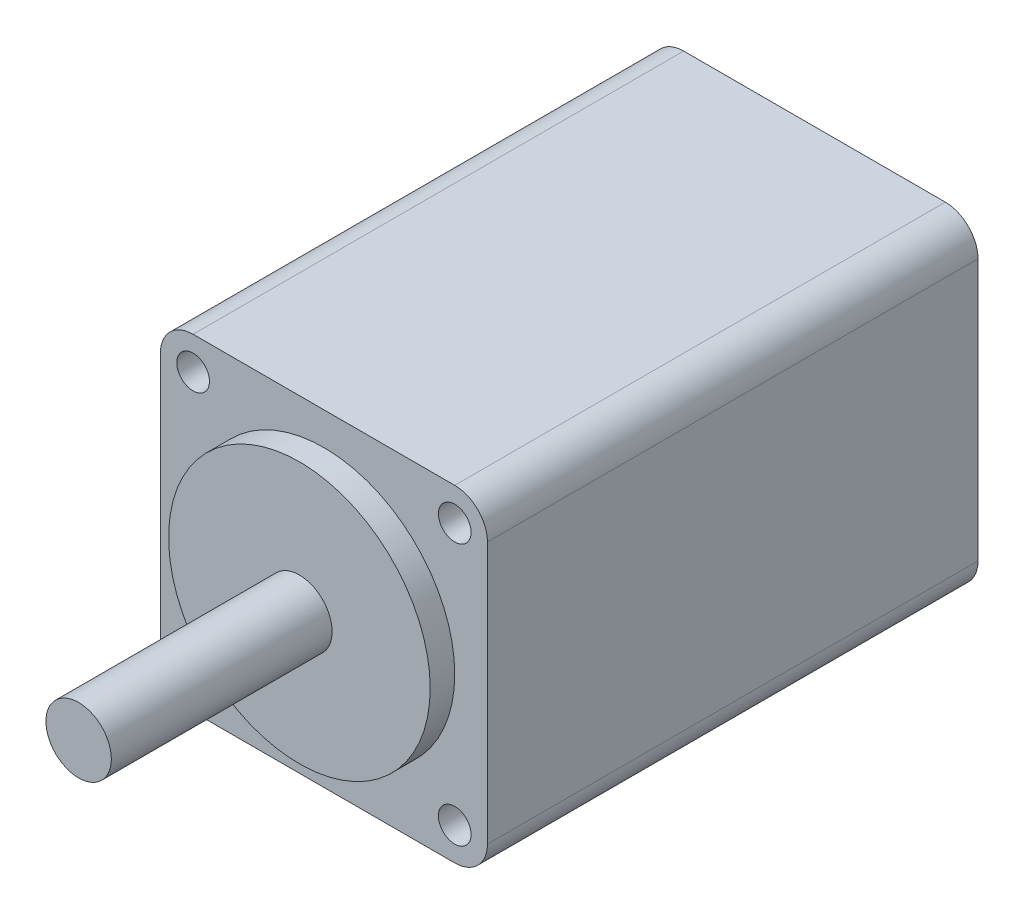
ISO-10303-21;
HEADER;
FILE_DESCRIPTION(('STEP AP214'),'2;1');
FILE_NAME('part.step','',(''),(''),'','','');
FILE_SCHEMA(('AUTOMOTIVE_DESIGN { 1 0 10303 214 1 1 1 1 }'));
ENDSEC;
DATA;
#1=APPLICATION_CONTEXT('core data for automotive mechanical design processes');
#2=APPLICATION_PROTOCOL_DEFINITION('international standard','automotive_design',2000,#1);
#3=PRODUCT_CONTEXT('',#1,'mechanical');
#4=PRODUCT('Part','Part','',(#3));
#5=PRODUCT_RELATED_PRODUCT_CATEGORY('part','',(#4));
#6=PRODUCT_DEFINITION_FORMATION('','',#4);
#7=PRODUCT_DEFINITION_CONTEXT('part definition',#1,'design');
#8=PRODUCT_DEFINITION('design','',#6,#7);
#9=PRODUCT_DEFINITION_SHAPE('','',#8);
#10=(LENGTH_UNIT() NAMED_UNIT(*) SI_UNIT(.MILLI.,.METRE.));
#11=(NAMED_UNIT(*) PLANE_ANGLE_UNIT() SI_UNIT($,.RADIAN.));
#12=(NAMED_UNIT(*) SI_UNIT($,.STERADIAN.) SOLID_ANGLE_UNIT());
#13=UNCERTAINTY_MEASURE_WITH_UNIT(LENGTH_MEASURE(1.E-05),#10,'distance_accuracy_value','');
#14=(GEOMETRIC_REPRESENTATION_CONTEXT(3) GLOBAL_UNCERTAINTY_ASSIGNED_CONTEXT((#13)) GLOBAL_UNIT_ASSIGNED_CONTEXT((#10,
#11,#12)) REPRESENTATION_CONTEXT('',''));
#15=CARTESIAN_POINT('',(0.,0.,0.));
#16=DIRECTION('',(0.,0.,1.));
#17=DIRECTION('',(1.,0.,0.));
#18=AXIS2_PLACEMENT_3D('',#15,#16,#17);
#19=CARTESIAN_POINT('',(10.,10.,-30.));
#20=DIRECTION('',(1.,0.,0.));
#21=DIRECTION('',(0.,1.,0.));
#22=AXIS2_PLACEMENT_3D('',#19,#20,#21);
#23=PLANE('',#22);
#24=DIRECTION('',(0.,1.,0.));
#25=VECTOR('',#24,1.);
#26=CARTESIAN_POINT('',(10.,10.,0.));
#27=LINE('',#26,#25);
#28=CARTESIAN_POINT('',(10.,-8.,0.));
#29=VERTEX_POINT('',#28);
#30=CARTESIAN_POINT('',(10.,8.,0.));
#31=VERTEX_POINT('',#30);
#32=EDGE_CURVE('E154',#29,#31,#27,.T.);
#33=ORIENTED_EDGE('',*,*,#32,.F.);
#34=DIRECTION('',(0.,0.,1.));
#35=VECTOR('',#34,1.);
#36=CARTESIAN_POINT('',(10.,-8.,-30.));
#37=LINE('',#36,#35);
#38=CARTESIAN_POINT('',(10.,-8.,-30.));
#39=VERTEX_POINT('',#38);
#40=EDGE_CURVE('E12',#29,#39,#37,.F.);
#41=ORIENTED_EDGE('',*,*,#40,.T.);
#42=DIRECTION('',(0.,1.,0.));
#43=VECTOR('',#42,1.);
#44=CARTESIAN_POINT('',(10.,10.,-30.));
#45=LINE('',#44,#43);
#46=CARTESIAN_POINT('',(10.,8.,-30.));
#47=VERTEX_POINT('',#46);
#48=EDGE_CURVE('E157',#39,#47,#45,.T.);
#49=ORIENTED_EDGE('',*,*,#48,.T.);
#50=DIRECTION('',(0.,0.,1.));
#51=VECTOR('',#50,1.);
#52=CARTESIAN_POINT('',(10.,8.,-30.));
#53=LINE('',#52,#51);
#54=EDGE_CURVE('E42',#47,#31,#53,.T.);
#55=ORIENTED_EDGE('',*,*,#54,.T.);
#56=EDGE_LOOP('',(#33,#41,#49,#55));
#57=FACE_BOUND('',#56,.T.);
#58=ADVANCED_FACE('F34',(#57),#23,.T.);
#59=CARTESIAN_POINT('',(-10.,-10.,-30.));
#60=DIRECTION('',(0.,-1.,0.));
#61=DIRECTION('',(0.,0.,-1.));
#62=AXIS2_PLACEMENT_3D('',#59,#60,#61);
#63=PLANE('',#62);
#64=DIRECTION('',(1.,0.,0.));
#65=VECTOR('',#64,1.);
#66=CARTESIAN_POINT('',(-10.,-10.,0.));
#67=LINE('',#66,#65);
#68=CARTESIAN_POINT('',(-8.,-10.,0.));
#69=VERTEX_POINT('',#68);
#70=CARTESIAN_POINT('',(8.,-10.,0.));
#71=VERTEX_POINT('',#70);
#72=EDGE_CURVE('E119',#69,#71,#67,.T.);
#73=ORIENTED_EDGE('',*,*,#72,.F.);
#74=DIRECTION('',(0.,0.,1.));
#75=VECTOR('',#74,1.);
#76=CARTESIAN_POINT('',(-8.,-10.,-30.));
#77=LINE('',#76,#75);
#78=CARTESIAN_POINT('',(-8.,-10.,-30.));
#79=VERTEX_POINT('',#78);
#80=EDGE_CURVE('E137',#69,#79,#77,.F.);
#81=ORIENTED_EDGE('',*,*,#80,.T.);
#82=DIRECTION('',(1.,0.,0.));
#83=VECTOR('',#82,1.);
#84=CARTESIAN_POINT('',(-10.,-10.,-30.));
#85=LINE('',#84,#83);
#86=CARTESIAN_POINT('',(8.,-10.,-30.));
#87=VERTEX_POINT('',#86);
#88=EDGE_CURVE('E122',#79,#87,#85,.T.);
#89=ORIENTED_EDGE('',*,*,#88,.T.);
#90=DIRECTION('',(0.,0.,1.));
#91=VECTOR('',#90,1.);
#92=CARTESIAN_POINT('',(8.,-10.,-30.));
#93=LINE('',#92,#91);
#94=EDGE_CURVE('E134',#87,#71,#93,.T.);
#95=ORIENTED_EDGE('',*,*,#94,.T.);
#96=EDGE_LOOP('',(#73,#81,#89,#95));
#97=FACE_BOUND('',#96,.T.);
#98=ADVANCED_FACE('F246',(#97),#63,.T.);
#99=CARTESIAN_POINT('',(-10.,10.,-30.));
#100=DIRECTION('',(-1.,0.,0.));
#101=DIRECTION('',(0.,-1.,0.));
#102=AXIS2_PLACEMENT_3D('',#99,#100,#101);
#103=PLANE('',#102);
#104=DIRECTION('',(0.,-1.,0.));
#105=VECTOR('',#104,1.);
#106=CARTESIAN_POINT('',(-10.,10.,-30.));
#107=LINE('',#106,#105);
#108=CARTESIAN_POINT('',(-10.,8.,-30.));
#109=VERTEX_POINT('',#108);
#110=CARTESIAN_POINT('',(-10.,-8.,-30.));
#111=VERTEX_POINT('',#110);
#112=EDGE_CURVE('E127',#109,#111,#107,.T.);
#113=ORIENTED_EDGE('',*,*,#112,.T.);
#114=DIRECTION('',(0.,0.,1.));
#115=VECTOR('',#114,1.);
#116=CARTESIAN_POINT('',(-10.,-8.,-30.));
#117=LINE('',#116,#115);
#118=CARTESIAN_POINT('',(-10.,-8.,0.));
#119=VERTEX_POINT('',#118);
#120=EDGE_CURVE('E118',#111,#119,#117,.T.);
#121=ORIENTED_EDGE('',*,*,#120,.T.);
#122=DIRECTION('',(0.,-1.,0.));
#123=VECTOR('',#122,1.);
#124=CARTESIAN_POINT('',(-10.,10.,0.));
#125=LINE('',#124,#123);
#126=CARTESIAN_POINT('',(-10.,8.,0.));
#127=VERTEX_POINT('',#126);
#128=EDGE_CURVE('E103',#127,#119,#125,.T.);
#129=ORIENTED_EDGE('',*,*,#128,.F.);
#130=DIRECTION('',(0.,0.,1.));
#131=VECTOR('',#130,1.);
#132=CARTESIAN_POINT('',(-10.,8.,-30.));
#133=LINE('',#132,#131);
#134=EDGE_CURVE('E116',#127,#109,#133,.F.);
#135=ORIENTED_EDGE('',*,*,#134,.T.);
#136=EDGE_LOOP('',(#113,#121,#129,#135));
#137=FACE_BOUND('',#136,.T.);
#138=ADVANCED_FACE('F115',(#137),#103,.T.);
#139=CARTESIAN_POINT('',(-10.,10.,-30.));
#140=DIRECTION('',(0.,1.,0.));
#141=DIRECTION('',(0.,0.,1.));
#142=AXIS2_PLACEMENT_3D('',#139,#140,#141);
#143=PLANE('',#142);
#144=DIRECTION('',(-1.,0.,0.));
#145=VECTOR('',#144,1.);
#146=CARTESIAN_POINT('',(-10.,10.,-30.));
#147=LINE('',#146,#145);
#148=CARTESIAN_POINT('',(8.,10.,-30.));
#149=VERTEX_POINT('',#148);
#150=CARTESIAN_POINT('',(-8.,10.,-30.));
#151=VERTEX_POINT('',#150);
#152=EDGE_CURVE('E169',#149,#151,#147,.T.);
#153=ORIENTED_EDGE('',*,*,#152,.T.);
#154=DIRECTION('',(0.,0.,1.));
#155=VECTOR('',#154,1.);
#156=CARTESIAN_POINT('',(-8.,10.,-30.));
#157=LINE('',#156,#155);
#158=CARTESIAN_POINT('',(-8.,10.,0.));
#159=VERTEX_POINT('',#158);
#160=EDGE_CURVE('E147',#151,#159,#157,.T.);
#161=ORIENTED_EDGE('',*,*,#160,.T.);
#162=DIRECTION('',(-1.,0.,0.));
#163=VECTOR('',#162,1.);
#164=CARTESIAN_POINT('',(-10.,10.,0.));
#165=LINE('',#164,#163);
#166=CARTESIAN_POINT('',(8.,10.,0.));
#167=VERTEX_POINT('',#166);
#168=EDGE_CURVE('E104',#167,#159,#165,.T.);
#169=ORIENTED_EDGE('',*,*,#168,.F.);
#170=DIRECTION('',(0.,0.,1.));
#171=VECTOR('',#170,1.);
#172=CARTESIAN_POINT('',(8.,10.,-30.));
#173=LINE('',#172,#171);
#174=EDGE_CURVE('E56',#167,#149,#173,.F.);
#175=ORIENTED_EDGE('',*,*,#174,.T.);
#176=EDGE_LOOP('',(#153,#161,#169,#175));
#177=FACE_BOUND('',#176,.T.);
#178=ADVANCED_FACE('F255',(#177),#143,.T.);
#179=CARTESIAN_POINT('',(0.,0.,-30.));
#180=DIRECTION('',(0.,0.,1.));
#181=DIRECTION('',(1.,0.,0.));
#182=AXIS2_PLACEMENT_3D('',#179,#180,#181);
#183=PLANE('',#182);
#184=ORIENTED_EDGE('',*,*,#88,.F.);
#185=CARTESIAN_POINT('',(-8.,-8.,-30.));
#186=DIRECTION('',(0.,0.,1.));
#187=DIRECTION('',(1.,0.,0.));
#188=AXIS2_PLACEMENT_3D('',#185,#186,#187);
#189=CIRCLE('',#188,2.);
#190=EDGE_CURVE('E144',#79,#111,#189,.F.);
#191=ORIENTED_EDGE('',*,*,#190,.T.);
#192=ORIENTED_EDGE('',*,*,#112,.F.);
#193=CARTESIAN_POINT('',(-8.,8.,-30.));
#194=DIRECTION('',(0.,0.,1.));
#195=DIRECTION('',(1.,0.,0.));
#196=AXIS2_PLACEMENT_3D('',#193,#194,#195);
#197=CIRCLE('',#196,2.);
#198=EDGE_CURVE('E49',#109,#151,#197,.F.);
#199=ORIENTED_EDGE('',*,*,#198,.T.);
#200=ORIENTED_EDGE('',*,*,#152,.F.);
#201=CARTESIAN_POINT('',(8.,8.,-30.));
#202=DIRECTION('',(0.,0.,1.));
#203=DIRECTION('',(1.,0.,0.));
#204=AXIS2_PLACEMENT_3D('',#201,#202,#203);
#205=CIRCLE('',#204,2.);
#206=EDGE_CURVE('E139',#149,#47,#205,.F.);
#207=ORIENTED_EDGE('',*,*,#206,.T.);
#208=ORIENTED_EDGE('',*,*,#48,.F.);
#209=CARTESIAN_POINT('',(8.,-8.,-30.));
#210=DIRECTION('',(0.,0.,1.));
#211=DIRECTION('',(1.,0.,0.));
#212=AXIS2_PLACEMENT_3D('',#209,#210,#211);
#213=CIRCLE('',#212,2.);
#214=EDGE_CURVE('E141',#39,#87,#213,.F.);
#215=ORIENTED_EDGE('',*,*,#214,.T.);
#216=EDGE_LOOP('',(#184,#191,#192,#199,#200,#207,#208,#215));
#217=FACE_BOUND('',#216,.T.);
#218=ADVANCED_FACE('F223',(#217),#183,.F.);
#219=CARTESIAN_POINT('',(0.,0.,0.));
#220=DIRECTION('',(0.,0.,1.));
#221=DIRECTION('',(1.,0.,0.));
#222=AXIS2_PLACEMENT_3D('',#219,#220,#221);
#223=PLANE('',#222);
#224=CARTESIAN_POINT('',(0.,0.,0.));
#225=DIRECTION('',(0.,0.,1.));
#226=DIRECTION('',(1.,0.,0.));
#227=AXIS2_PLACEMENT_3D('',#224,#225,#226);
#228=CIRCLE('',#227,8.);
#229=CARTESIAN_POINT('',(8.,0.,0.));
#230=VERTEX_POINT('',#229);
#231=EDGE_CURVE('E193',#230,#230,#228,.T.);
#232=ORIENTED_EDGE('',*,*,#231,.F.);
#233=EDGE_LOOP('',(#232));
#234=FACE_BOUND('',#233,.T.);
#235=CARTESIAN_POINT('',(8.,8.,0.));
#236=DIRECTION('',(0.,0.,1.));
#237=DIRECTION('',(1.,0.,0.));
#238=AXIS2_PLACEMENT_3D('',#235,#236,#237);
#239=CIRCLE('',#238,0.999999999999999);
#240=CARTESIAN_POINT('',(9.,8.,0.));
#241=VERTEX_POINT('',#240);
#242=EDGE_CURVE('E188',#241,#241,#239,.T.);
#243=ORIENTED_EDGE('',*,*,#242,.F.);
#244=EDGE_LOOP('',(#243));
#245=FACE_BOUND('',#244,.T.);
#246=CARTESIAN_POINT('',(8.,-8.,0.));
#247=DIRECTION('',(0.,0.,1.));
#248=DIRECTION('',(1.,0.,0.));
#249=AXIS2_PLACEMENT_3D('',#246,#247,#248);
#250=CIRCLE('',#249,1.);
#251=CARTESIAN_POINT('',(9.,-8.,0.));
#252=VERTEX_POINT('',#251);
#253=EDGE_CURVE('E182',#252,#252,#250,.T.);
#254=ORIENTED_EDGE('',*,*,#253,.F.);
#255=EDGE_LOOP('',(#254));
#256=FACE_BOUND('',#255,.T.);
#257=CARTESIAN_POINT('',(-8.,-8.,0.));
#258=DIRECTION('',(0.,0.,1.));
#259=DIRECTION('',(1.,0.,0.));
#260=AXIS2_PLACEMENT_3D('',#257,#258,#259);
#261=CIRCLE('',#260,1.);
#262=CARTESIAN_POINT('',(-7.,-8.,0.));
#263=VERTEX_POINT('',#262);
#264=EDGE_CURVE('E175',#263,#263,#261,.T.);
#265=ORIENTED_EDGE('',*,*,#264,.F.);
#266=EDGE_LOOP('',(#265));
#267=FACE_BOUND('',#266,.T.);
#268=CARTESIAN_POINT('',(-8.,8.,0.));
#269=DIRECTION('',(0.,0.,1.));
#270=DIRECTION('',(1.,0.,0.));
#271=AXIS2_PLACEMENT_3D('',#268,#269,#270);
#272=CIRCLE('',#271,1.);
#273=CARTESIAN_POINT('',(-7.,8.,0.));
#274=VERTEX_POINT('',#273);
#275=EDGE_CURVE('E165',#274,#274,#272,.T.);
#276=ORIENTED_EDGE('',*,*,#275,.F.);
#277=EDGE_LOOP('',(#276));
#278=FACE_BOUND('',#277,.T.);
#279=ORIENTED_EDGE('',*,*,#128,.T.);
#280=CARTESIAN_POINT('',(-8.,-8.,0.));
#281=DIRECTION('',(0.,0.,1.));
#282=DIRECTION('',(1.,0.,0.));
#283=AXIS2_PLACEMENT_3D('',#280,#281,#282);
#284=CIRCLE('',#283,2.);
#285=EDGE_CURVE('E109',#119,#69,#284,.T.);
#286=ORIENTED_EDGE('',*,*,#285,.T.);
#287=ORIENTED_EDGE('',*,*,#72,.T.);
#288=CARTESIAN_POINT('',(8.,-8.,0.));
#289=DIRECTION('',(0.,0.,1.));
#290=DIRECTION('',(1.,0.,0.));
#291=AXIS2_PLACEMENT_3D('',#288,#289,#290);
#292=CIRCLE('',#291,2.);
#293=EDGE_CURVE('E110',#71,#29,#292,.T.);
#294=ORIENTED_EDGE('',*,*,#293,.T.);
#295=ORIENTED_EDGE('',*,*,#32,.T.);
#296=CARTESIAN_POINT('',(8.,8.,0.));
#297=DIRECTION('',(0.,0.,1.));
#298=DIRECTION('',(1.,0.,0.));
#299=AXIS2_PLACEMENT_3D('',#296,#297,#298);
#300=CIRCLE('',#299,2.);
#301=EDGE_CURVE('E124',#31,#167,#300,.T.);
#302=ORIENTED_EDGE('',*,*,#301,.T.);
#303=ORIENTED_EDGE('',*,*,#168,.T.);
#304=CARTESIAN_POINT('',(-8.,8.,0.));
#305=DIRECTION('',(0.,0.,1.));
#306=DIRECTION('',(1.,0.,0.));
#307=AXIS2_PLACEMENT_3D('',#304,#305,#306);
#308=CIRCLE('',#307,2.);
#309=EDGE_CURVE('E100',#159,#127,#308,.T.);
#310=ORIENTED_EDGE('',*,*,#309,.T.);
#311=EDGE_LOOP('',(#279,#286,#287,#294,#295,#302,#303,#310));
#312=FACE_BOUND('',#311,.T.);
#313=ADVANCED_FACE('F102',(#234,#245,#256,#267,#278,#312),#223,.T.);
#314=CARTESIAN_POINT('',(-8.,8.,-6.));
#315=DIRECTION('',(0.,0.,1.));
#316=DIRECTION('',(1.,0.,0.));
#317=AXIS2_PLACEMENT_3D('',#314,#315,#316);
#318=CYLINDRICAL_SURFACE('',#317,1.);
#319=CARTESIAN_POINT('',(-8.,8.,-6.));
#320=DIRECTION('',(0.,0.,1.));
#321=DIRECTION('',(1.,0.,0.));
#322=AXIS2_PLACEMENT_3D('',#319,#320,#321);
#323=CIRCLE('',#322,1.);
#324=CARTESIAN_POINT('',(-7.,8.,-6.));
#325=VERTEX_POINT('',#324);
#326=EDGE_CURVE('E161',#325,#325,#323,.T.);
#327=ORIENTED_EDGE('',*,*,#326,.F.);
#328=EDGE_LOOP('',(#327));
#329=FACE_BOUND('',#328,.T.);
#330=ORIENTED_EDGE('',*,*,#275,.T.);
#331=EDGE_LOOP('',(#330));
#332=FACE_BOUND('',#331,.T.);
#333=ADVANCED_FACE('F222',(#329,#332),#318,.F.);
#334=CARTESIAN_POINT('',(-8.,8.,-6.));
#335=DIRECTION('',(0.,0.,1.));
#336=DIRECTION('',(1.,0.,0.));
#337=AXIS2_PLACEMENT_3D('',#334,#335,#336);
#338=PLANE('',#337);
#339=ORIENTED_EDGE('',*,*,#326,.T.);
#340=EDGE_LOOP('',(#339));
#341=FACE_BOUND('',#340,.T.);
#342=ADVANCED_FACE('F234',(#341),#338,.T.);
#343=CARTESIAN_POINT('',(-8.,-8.,-6.));
#344=DIRECTION('',(0.,0.,1.));
#345=DIRECTION('',(1.,0.,0.));
#346=AXIS2_PLACEMENT_3D('',#343,#344,#345);
#347=CYLINDRICAL_SURFACE('',#346,1.);
#348=CARTESIAN_POINT('',(-8.,-8.,-6.));
#349=DIRECTION('',(0.,0.,1.));
#350=DIRECTION('',(1.,0.,0.));
#351=AXIS2_PLACEMENT_3D('',#348,#349,#350);
#352=CIRCLE('',#351,1.);
#353=CARTESIAN_POINT('',(-7.,-8.,-6.));
#354=VERTEX_POINT('',#353);
#355=EDGE_CURVE('E178',#354,#354,#352,.T.);
#356=ORIENTED_EDGE('',*,*,#355,.F.);
#357=EDGE_LOOP('',(#356));
#358=FACE_BOUND('',#357,.T.);
#359=ORIENTED_EDGE('',*,*,#264,.T.);
#360=EDGE_LOOP('',(#359));
#361=FACE_BOUND('',#360,.T.);
#362=ADVANCED_FACE('F240',(#358,#361),#347,.F.);
#363=CARTESIAN_POINT('',(-8.,-8.,-6.));
#364=DIRECTION('',(0.,0.,1.));
#365=DIRECTION('',(1.,0.,0.));
#366=AXIS2_PLACEMENT_3D('',#363,#364,#365);
#367=PLANE('',#366);
#368=ORIENTED_EDGE('',*,*,#355,.T.);
#369=EDGE_LOOP('',(#368));
#370=FACE_BOUND('',#369,.T.);
#371=ADVANCED_FACE('F330',(#370),#367,.T.);
#372=CARTESIAN_POINT('',(8.,-8.,-6.));
#373=DIRECTION('',(0.,0.,1.));
#374=DIRECTION('',(1.,0.,0.));
#375=AXIS2_PLACEMENT_3D('',#372,#373,#374);
#376=CYLINDRICAL_SURFACE('',#375,1.);
#377=CARTESIAN_POINT('',(8.,-8.,-6.));
#378=DIRECTION('',(0.,0.,1.));
#379=DIRECTION('',(1.,0.,0.));
#380=AXIS2_PLACEMENT_3D('',#377,#378,#379);
#381=CIRCLE('',#380,1.);
#382=CARTESIAN_POINT('',(9.,-8.,-6.));
#383=VERTEX_POINT('',#382);
#384=EDGE_CURVE('E185',#383,#383,#381,.T.);
#385=ORIENTED_EDGE('',*,*,#384,.F.);
#386=EDGE_LOOP('',(#385));
#387=FACE_BOUND('',#386,.T.);
#388=ORIENTED_EDGE('',*,*,#253,.T.);
#389=EDGE_LOOP('',(#388));
#390=FACE_BOUND('',#389,.T.);
#391=ADVANCED_FACE('F320',(#387,#390),#376,.F.);
#392=CARTESIAN_POINT('',(8.,-8.,-6.));
#393=DIRECTION('',(0.,0.,1.));
#394=DIRECTION('',(1.,0.,0.));
#395=AXIS2_PLACEMENT_3D('',#392,#393,#394);
#396=PLANE('',#395);
#397=ORIENTED_EDGE('',*,*,#384,.T.);
#398=EDGE_LOOP('',(#397));
#399=FACE_BOUND('',#398,.T.);
#400=ADVANCED_FACE('F310',(#399),#396,.T.);
#401=CARTESIAN_POINT('',(8.,8.,-6.));
#402=DIRECTION('',(0.,0.,1.));
#403=DIRECTION('',(1.,0.,0.));
#404=AXIS2_PLACEMENT_3D('',#401,#402,#403);
#405=CYLINDRICAL_SURFACE('',#404,0.999999999999999);
#406=CARTESIAN_POINT('',(8.,8.,-6.));
#407=DIRECTION('',(0.,0.,1.));
#408=DIRECTION('',(1.,0.,0.));
#409=AXIS2_PLACEMENT_3D('',#406,#407,#408);
#410=CIRCLE('',#409,0.999999999999999);
#411=CARTESIAN_POINT('',(9.,8.,-6.));
#412=VERTEX_POINT('',#411);
#413=EDGE_CURVE('E173',#412,#412,#410,.T.);
#414=ORIENTED_EDGE('',*,*,#413,.F.);
#415=EDGE_LOOP('',(#414));
#416=FACE_BOUND('',#415,.T.);
#417=ORIENTED_EDGE('',*,*,#242,.T.);
#418=EDGE_LOOP('',(#417));
#419=FACE_BOUND('',#418,.T.);
#420=ADVANCED_FACE('F299',(#416,#419),#405,.F.);
#421=CARTESIAN_POINT('',(8.,8.,-6.));
#422=DIRECTION('',(0.,0.,1.));
#423=DIRECTION('',(1.,0.,0.));
#424=AXIS2_PLACEMENT_3D('',#421,#422,#423);
#425=PLANE('',#424);
#426=ORIENTED_EDGE('',*,*,#413,.T.);
#427=EDGE_LOOP('',(#426));
#428=FACE_BOUND('',#427,.T.);
#429=ADVANCED_FACE('F260',(#428),#425,.T.);
#430=CARTESIAN_POINT('',(-8.,-8.,-30.));
#431=DIRECTION('',(0.,0.,1.));
#432=DIRECTION('',(1.,0.,0.));
#433=AXIS2_PLACEMENT_3D('',#430,#431,#432);
#434=CYLINDRICAL_SURFACE('',#433,2.);
#435=ORIENTED_EDGE('',*,*,#190,.F.);
#436=ORIENTED_EDGE('',*,*,#80,.F.);
#437=ORIENTED_EDGE('',*,*,#285,.F.);
#438=ORIENTED_EDGE('',*,*,#120,.F.);
#439=EDGE_LOOP('',(#435,#436,#437,#438));
#440=FACE_BOUND('',#439,.T.);
#441=ADVANCED_FACE('F257',(#440),#434,.T.);
#442=CARTESIAN_POINT('',(-8.,8.,-30.));
#443=DIRECTION('',(0.,0.,1.));
#444=DIRECTION('',(1.,0.,0.));
#445=AXIS2_PLACEMENT_3D('',#442,#443,#444);
#446=CYLINDRICAL_SURFACE('',#445,2.);
#447=ORIENTED_EDGE('',*,*,#198,.F.);
#448=ORIENTED_EDGE('',*,*,#134,.F.);
#449=ORIENTED_EDGE('',*,*,#309,.F.);
#450=ORIENTED_EDGE('',*,*,#160,.F.);
#451=EDGE_LOOP('',(#447,#448,#449,#450));
#452=FACE_BOUND('',#451,.T.);
#453=ADVANCED_FACE('F121',(#452),#446,.T.);
#454=CARTESIAN_POINT('',(8.,-8.,-30.));
#455=DIRECTION('',(0.,0.,1.));
#456=DIRECTION('',(1.,0.,0.));
#457=AXIS2_PLACEMENT_3D('',#454,#455,#456);
#458=CYLINDRICAL_SURFACE('',#457,2.);
#459=ORIENTED_EDGE('',*,*,#214,.F.);
#460=ORIENTED_EDGE('',*,*,#40,.F.);
#461=ORIENTED_EDGE('',*,*,#293,.F.);
#462=ORIENTED_EDGE('',*,*,#94,.F.);
#463=EDGE_LOOP('',(#459,#460,#461,#462));
#464=FACE_BOUND('',#463,.T.);
#465=ADVANCED_FACE('F263',(#464),#458,.T.);
#466=CARTESIAN_POINT('',(8.,8.,-30.));
#467=DIRECTION('',(0.,0.,1.));
#468=DIRECTION('',(1.,0.,0.));
#469=AXIS2_PLACEMENT_3D('',#466,#467,#468);
#470=CYLINDRICAL_SURFACE('',#469,2.);
#471=ORIENTED_EDGE('',*,*,#206,.F.);
#472=ORIENTED_EDGE('',*,*,#174,.F.);
#473=ORIENTED_EDGE('',*,*,#301,.F.);
#474=ORIENTED_EDGE('',*,*,#54,.F.);
#475=EDGE_LOOP('',(#471,#472,#473,#474));
#476=FACE_BOUND('',#475,.T.);
#477=ADVANCED_FACE('F36',(#476),#470,.T.);
#478=CARTESIAN_POINT('',(0.,0.,1.5));
#479=DIRECTION('',(0.,0.,-1.));
#480=DIRECTION('',(-1.,0.,0.));
#481=AXIS2_PLACEMENT_3D('',#478,#479,#480);
#482=CYLINDRICAL_SURFACE('',#481,8.);
#483=CARTESIAN_POINT('',(0.,0.,1.5));
#484=DIRECTION('',(0.,0.,1.));
#485=DIRECTION('',(1.,0.,0.));
#486=AXIS2_PLACEMENT_3D('',#483,#484,#485);
#487=CIRCLE('',#486,8.);
#488=CARTESIAN_POINT('',(8.,0.,1.5));
#489=VERTEX_POINT('',#488);
#490=EDGE_CURVE('E179',#489,#489,#487,.T.);
#491=ORIENTED_EDGE('',*,*,#490,.F.);
#492=EDGE_LOOP('',(#491));
#493=FACE_BOUND('',#492,.T.);
#494=ORIENTED_EDGE('',*,*,#231,.T.);
#495=EDGE_LOOP('',(#494));
#496=FACE_BOUND('',#495,.T.);
#497=ADVANCED_FACE('F211',(#493,#496),#482,.T.);
#498=CARTESIAN_POINT('',(0.,0.,1.5));
#499=DIRECTION('',(0.,0.,1.));
#500=DIRECTION('',(1.,0.,0.));
#501=AXIS2_PLACEMENT_3D('',#498,#499,#500);
#502=PLANE('',#501);
#503=CARTESIAN_POINT('',(0.,0.,1.5));
#504=DIRECTION('',(0.,0.,1.));
#505=DIRECTION('',(1.,0.,0.));
#506=AXIS2_PLACEMENT_3D('',#503,#504,#505);
#507=CIRCLE('',#506,2.);
#508=CARTESIAN_POINT('',(2.,0.,1.5));
#509=VERTEX_POINT('',#508);
#510=EDGE_CURVE('E201',#509,#509,#507,.T.);
#511=ORIENTED_EDGE('',*,*,#510,.F.);
#512=EDGE_LOOP('',(#511));
#513=FACE_BOUND('',#512,.T.);
#514=ORIENTED_EDGE('',*,*,#490,.T.);
#515=EDGE_LOOP('',(#514));
#516=FACE_BOUND('',#515,.T.);
#517=ADVANCED_FACE('F208',(#513,#516),#502,.T.);
#518=CARTESIAN_POINT('',(0.,0.,35.6568542494924));
#519=DIRECTION('',(0.,0.,-1.));
#520=DIRECTION('',(-1.,0.,0.));
#521=AXIS2_PLACEMENT_3D('',#518,#519,#520);
#522=CYLINDRICAL_SURFACE('',#521,2.);
#523=ORIENTED_EDGE('',*,*,#510,.T.);
#524=EDGE_LOOP('',(#523));
#525=FACE_BOUND('',#524,.T.);
#526=CARTESIAN_POINT('',(0.,0.,15.));
#527=DIRECTION('',(0.,0.,1.));
#528=DIRECTION('',(1.,0.,0.));
#529=AXIS2_PLACEMENT_3D('',#526,#527,#528);
#530=CIRCLE('',#529,2.);
#531=CARTESIAN_POINT('',(2.,0.,15.));
#532=VERTEX_POINT('',#531);
#533=EDGE_CURVE('E196',#532,#532,#530,.T.);
#534=ORIENTED_EDGE('',*,*,#533,.F.);
#535=EDGE_LOOP('',(#534));
#536=FACE_BOUND('',#535,.T.);
#537=ADVANCED_FACE('F205',(#525,#536),#522,.T.);
#538=CARTESIAN_POINT('',(0.,0.,15.));
#539=DIRECTION('',(0.,0.,1.));
#540=DIRECTION('',(1.,0.,0.));
#541=AXIS2_PLACEMENT_3D('',#538,#539,#540);
#542=PLANE('',#541);
#543=ORIENTED_EDGE('',*,*,#533,.T.);
#544=EDGE_LOOP('',(#543));
#545=FACE_BOUND('',#544,.T.);
#546=ADVANCED_FACE('F413',(#545),#542,.T.);
#547=CLOSED_SHELL('',(#58,#98,#138,#178,#218,#313,#333,#342,#362,#371,#391,#400,#420,#429,#441,
#453,#465,#477,#497,#517,#537,#546));
#548=MANIFOLD_SOLID_BREP('B2',#547);
#549=ADVANCED_BREP_SHAPE_REPRESENTATION('',(#18,#548),#14);
#550=SHAPE_DEFINITION_REPRESENTATION(#9,#549);
ENDSEC;
END-ISO-10303-21;
